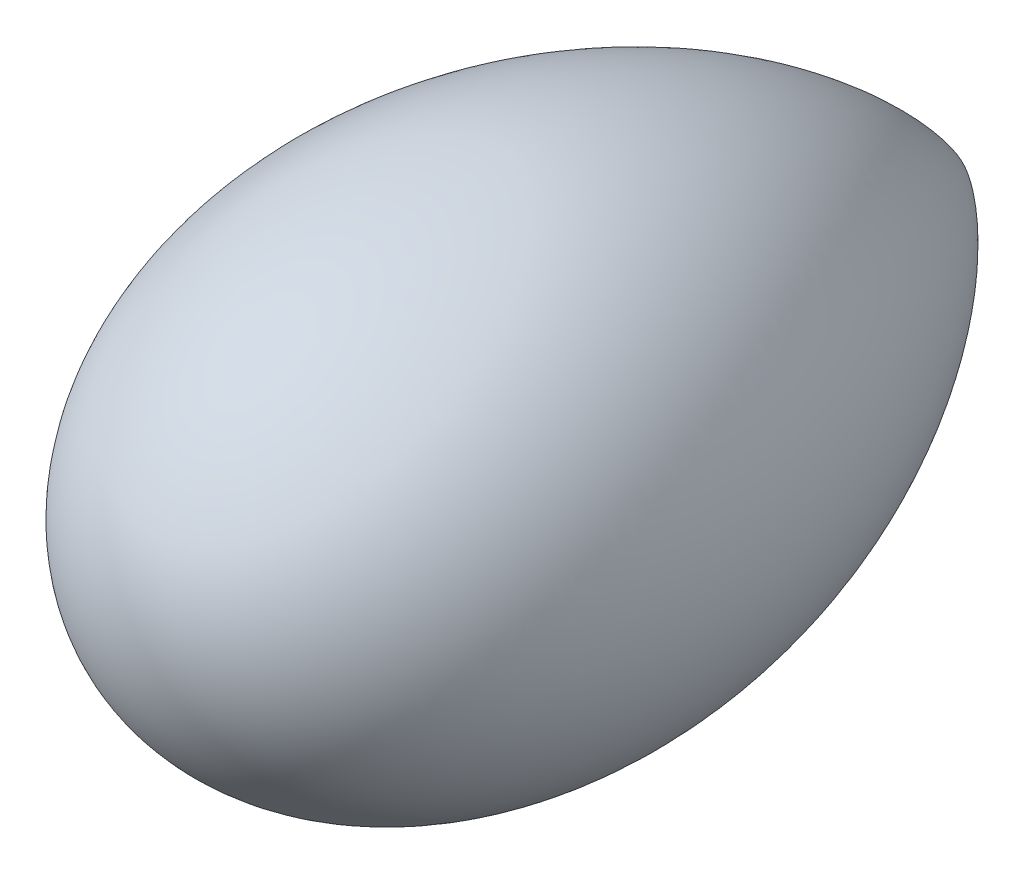
ISO-10303-21;
HEADER;
FILE_DESCRIPTION(('STEP AP214'),'2;1');
FILE_NAME('part.step','',(''),(''),'','','');
FILE_SCHEMA(('AUTOMOTIVE_DESIGN { 1 0 10303 214 1 1 1 1 }'));
ENDSEC;
DATA;
#1=APPLICATION_CONTEXT('core data for automotive mechanical design processes');
#2=APPLICATION_PROTOCOL_DEFINITION('international standard','automotive_design',2000,#1);
#3=PRODUCT_CONTEXT('',#1,'mechanical');
#4=PRODUCT('Part','Part','',(#3));
#5=PRODUCT_RELATED_PRODUCT_CATEGORY('part','',(#4));
#6=PRODUCT_DEFINITION_FORMATION('','',#4);
#7=PRODUCT_DEFINITION_CONTEXT('part definition',#1,'design');
#8=PRODUCT_DEFINITION('design','',#6,#7);
#9=PRODUCT_DEFINITION_SHAPE('','',#8);
#10=(LENGTH_UNIT() NAMED_UNIT(*) SI_UNIT(.MILLI.,.METRE.));
#11=(NAMED_UNIT(*) PLANE_ANGLE_UNIT() SI_UNIT($,.RADIAN.));
#12=(NAMED_UNIT(*) SI_UNIT($,.STERADIAN.) SOLID_ANGLE_UNIT());
#13=UNCERTAINTY_MEASURE_WITH_UNIT(LENGTH_MEASURE(1.E-05),#10,'distance_accuracy_value','');
#14=(GEOMETRIC_REPRESENTATION_CONTEXT(3) GLOBAL_UNCERTAINTY_ASSIGNED_CONTEXT((#13)) GLOBAL_UNIT_ASSIGNED_CONTEXT((#10,
#11,#12)) REPRESENTATION_CONTEXT('',''));
#15=CARTESIAN_POINT('',(0.,0.,0.));
#16=DIRECTION('',(0.,0.,1.));
#17=DIRECTION('',(1.,0.,0.));
#18=AXIS2_PLACEMENT_3D('',#15,#16,#17);
#19=CARTESIAN_POINT('',(1.21746964497283E-12,0.,111.46260013653));
#20=CARTESIAN_POINT('',(0.119663795632793,0.,111.46260013653));
#21=CARTESIAN_POINT('',(0.359418154572468,0.,111.460806702534));
#22=CARTESIAN_POINT('',(0.813396549933653,0.,111.452736250165));
#23=CARTESIAN_POINT('',(1.29199210676911,0.,111.431224933905));
#24=CARTESIAN_POINT('',(1.77179781540944,0.,111.403012927112));
#25=CARTESIAN_POINT('',(2.15418146175772,0.,111.372142779226));
#26=CARTESIAN_POINT('',(2.54742862141491,0.,111.335936552702));
#27=CARTESIAN_POINT('',(2.93713214133951,0.,111.29440521904));
#28=CARTESIAN_POINT('',(3.39173716178687,0.,111.238212731978));
#29=CARTESIAN_POINT('',(4.03916241382257,0.,111.144742729388));
#30=CARTESIAN_POINT('',(4.81289619622294,0.,111.011600029192));
#31=CARTESIAN_POINT('',(5.70991812439508,0.,110.826003494658));
#32=CARTESIAN_POINT('',(6.97978766455311,0.,110.509904393202));
#33=CARTESIAN_POINT('',(8.48204632926122,0.,110.050755161886));
#34=CARTESIAN_POINT('',(9.952102864366,0.,109.4954279195));
#35=CARTESIAN_POINT('',(11.6225674906414,0.,108.741947993922));
#36=CARTESIAN_POINT('',(13.2441001360033,0.,107.888296829864));
#37=CARTESIAN_POINT('',(14.8128252575007,0.,106.94005690529));
#38=CARTESIAN_POINT('',(16.5277569618532,0.,105.737112094324));
#39=CARTESIAN_POINT('',(18.1607810620796,0.,104.425339584756));
#40=CARTESIAN_POINT('',(19.7091654695573,0.,103.014848365321));
#41=CARTESIAN_POINT('',(21.171272091536,0.,101.515265025055));
#42=CARTESIAN_POINT('',(22.5463386816813,0.,99.9356371776898));
#43=CARTESIAN_POINT('',(24.1563398195087,0.,97.8715430642102));
#44=CARTESIAN_POINT('',(25.7407367747211,0.,95.5252173081264));
#45=CARTESIAN_POINT('',(27.2622876513046,0.,92.8895687010557));
#46=CARTESIAN_POINT('',(28.59156814644,0.,90.1532653790211));
#47=CARTESIAN_POINT('',(29.5695468367407,0.,87.8330112832781));
#48=CARTESIAN_POINT('',(30.5488001817823,0.,85.1787856860964));
#49=CARTESIAN_POINT('',(31.4832931808287,0.,82.1793690635095));
#50=CARTESIAN_POINT('',(32.3588598659516,0.,78.619288625444));
#51=CARTESIAN_POINT('',(33.2590132044147,0.,73.4602814236018));
#52=CARTESIAN_POINT('',(33.8042518059979,0.,67.1946078311029));
#53=CARTESIAN_POINT('',(33.7131138721134,0.,59.8530907527881));
#54=CARTESIAN_POINT('',(32.6919746751706,0.,51.5268964861419));
#55=CARTESIAN_POINT('',(30.8192032286581,0.,43.3515740901067));
#56=CARTESIAN_POINT('',(28.1468373255789,0.,35.4024830158736));
#57=CARTESIAN_POINT('',(24.7148897427776,0.,27.7507860460519));
#58=CARTESIAN_POINT('',(21.0719802606443,0.,21.3806075933545));
#59=CARTESIAN_POINT('',(17.5018261958731,0.,16.2063104946718));
#60=CARTESIAN_POINT('',(14.2271665120468,0.,12.1209880445207));
#61=CARTESIAN_POINT('',(11.7754989726939,0.,9.3963927044084));
#62=CARTESIAN_POINT('',(9.55698811010727,0.,7.17262355469425));
#63=CARTESIAN_POINT('',(7.76919538259728,0.,5.53549047653436));
#64=CARTESIAN_POINT('',(6.47339406391217,0.,4.42326079817697));
#65=CARTESIAN_POINT('',(5.03799194636458,0.,3.26393122614762));
#66=CARTESIAN_POINT('',(3.82810988961921,0.,2.35734358756431));
#67=CARTESIAN_POINT('',(2.70089524588899,0.,1.5761044842962));
#68=CARTESIAN_POINT('',(1.66134522589941,0.,0.917684938021807));
#69=CARTESIAN_POINT('',(1.0905943440891,0.,0.577144213723487));
#70=CARTESIAN_POINT('',(0.593460457008534,0.,0.298966802230689));
#71=CARTESIAN_POINT('',(0.256786725815097,0.,0.123170174141032));
#72=CARTESIAN_POINT('',(0.0860041808827817,0.,0.0402285197195553));
#73=CARTESIAN_POINT('',(0.,0.,0.));
#74=B_SPLINE_CURVE_WITH_KNOTS('',4,(#19,#20,#21,#22,#23,#24,#25,#26,#27,#28,#29,#30,#31,#32,#33,
#34,#35,#36,#37,#38,#39,#40,#41,#42,#43,#44,#45,#46,#47,#48,#49,#50,#51,#52,#53,#54,#55,#56,#57,
#58,#59,#60,#61,#62,#63,#64,#65,#66,#67,#68,#69,#70,#71,#72,#73),.UNSPECIFIED.,.F.,.F.,(5,1,1,1,
1,1,1,1,1,1,1,1,1,1,1,1,1,1,1,1,1,1,1,1,1,1,1,1,1,1,1,1,1,1,1,1,1,1,1,1,1,1,1,1,1,1,1,1,1,1,1,
5),(0.0853246715427618,0.0887485509040368,0.0921724302653117,0.0955963096265867,
0.0990201889878616,0.100732128668499,0.102444068349137,0.105867947710412,0.109291827071686,
0.112715706432961,0.119563473031121,0.12641123962928,0.133259006227439,0.14695454522692,
0.160650090029563,0.167497862430884,0.181193345776511,0.194888829122138,0.208584415628072,
0.222280002134007,0.235975530838741,0.249671059543476,0.263366620179581,0.277062180815685,
0.304453170294509,0.323693004216435,0.342932838138361,0.356628382317244,0.370323926496127,
0.397715014853894,0.425106104514257,0.45249719417462,0.507279373703119,0.562061567924162,
0.616843748917064,0.67162593046471,0.726408051134821,0.781190345492604,0.835972549580629,
0.863363608938114,0.8907546682956,0.918145813941736,0.931841386764804,0.945536959587871,
0.954183704686658,0.962830449785445,0.980123939983018,0.985092954987263,0.990061969991509,
0.995030984995754,0.997515492497877,1.),.UNSPECIFIED.);
#75=CARTESIAN_POINT('',(0.,0.,0.));
#76=DIRECTION('',(0.,0.,-1.));
#77=AXIS1_PLACEMENT('',#75,#76);
#78=SURFACE_OF_REVOLUTION('',#74,#77);
#79=CARTESIAN_POINT('',(0.,0.,0.));
#80=VERTEX_POINT('',#79);
#81=VERTEX_LOOP('',#80);
#82=FACE_BOUND('',#81,.T.);
#83=CARTESIAN_POINT('',(0.,0.,111.46260013653));
#84=VERTEX_POINT('',#83);
#85=VERTEX_LOOP('',#84);
#86=FACE_BOUND('',#85,.T.);
#87=ADVANCED_FACE('F40',(#82,#86),#78,.T.);
#88=CLOSED_SHELL('',(#87));
#89=MANIFOLD_SOLID_BREP('B2',#88);
#90=ADVANCED_BREP_SHAPE_REPRESENTATION('',(#18,#89),#14);
#91=SHAPE_DEFINITION_REPRESENTATION(#9,#90);
ENDSEC;
END-ISO-10303-21;
